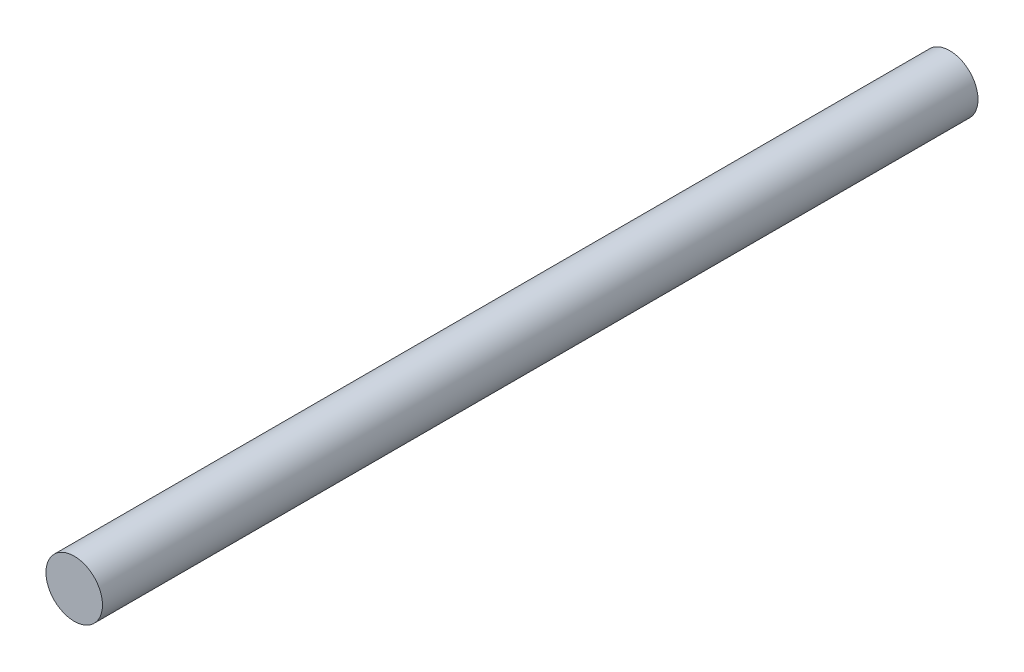
ISO-10303-21;
HEADER;
FILE_DESCRIPTION(('STEP AP214'),'2;1');
FILE_NAME('part.step','',(''),(''),'','','');
FILE_SCHEMA(('AUTOMOTIVE_DESIGN { 1 0 10303 214 1 1 1 1 }'));
ENDSEC;
DATA;
#1=APPLICATION_CONTEXT('core data for automotive mechanical design processes');
#2=APPLICATION_PROTOCOL_DEFINITION('international standard','automotive_design',2000,#1);
#3=PRODUCT_CONTEXT('',#1,'mechanical');
#4=PRODUCT('Part','Part','',(#3));
#5=PRODUCT_RELATED_PRODUCT_CATEGORY('part','',(#4));
#6=PRODUCT_DEFINITION_FORMATION('','',#4);
#7=PRODUCT_DEFINITION_CONTEXT('part definition',#1,'design');
#8=PRODUCT_DEFINITION('design','',#6,#7);
#9=PRODUCT_DEFINITION_SHAPE('','',#8);
#10=(LENGTH_UNIT() NAMED_UNIT(*) SI_UNIT(.MILLI.,.METRE.));
#11=(NAMED_UNIT(*) PLANE_ANGLE_UNIT() SI_UNIT($,.RADIAN.));
#12=(NAMED_UNIT(*) SI_UNIT($,.STERADIAN.) SOLID_ANGLE_UNIT());
#13=UNCERTAINTY_MEASURE_WITH_UNIT(LENGTH_MEASURE(1.E-05),#10,'distance_accuracy_value','');
#14=(GEOMETRIC_REPRESENTATION_CONTEXT(3) GLOBAL_UNCERTAINTY_ASSIGNED_CONTEXT((#13)) GLOBAL_UNIT_ASSIGNED_CONTEXT((#10,
#11,#12)) REPRESENTATION_CONTEXT('',''));
#15=CARTESIAN_POINT('',(0.,0.,0.));
#16=DIRECTION('',(0.,0.,1.));
#17=DIRECTION('',(1.,0.,0.));
#18=AXIS2_PLACEMENT_3D('',#15,#16,#17);
#19=CARTESIAN_POINT('',(0.,0.,15.8));
#20=DIRECTION('',(0.,0.,-1.));
#21=DIRECTION('',(-1.,0.,0.));
#22=AXIS2_PLACEMENT_3D('',#19,#20,#21);
#23=CYLINDRICAL_SURFACE('',#22,0.51);
#24=CARTESIAN_POINT('',(0.,0.,15.8));
#25=DIRECTION('',(0.,0.,1.));
#26=DIRECTION('',(1.,0.,0.));
#27=AXIS2_PLACEMENT_3D('',#24,#25,#26);
#28=CIRCLE('',#27,0.51);
#29=CARTESIAN_POINT('',(0.51,0.,15.8));
#30=VERTEX_POINT('',#29);
#31=EDGE_CURVE('E10',#30,#30,#28,.T.);
#32=ORIENTED_EDGE('',*,*,#31,.F.);
#33=EDGE_LOOP('',(#32));
#34=FACE_BOUND('',#33,.T.);
#35=CARTESIAN_POINT('',(0.,0.,0.));
#36=DIRECTION('',(0.,0.,1.));
#37=DIRECTION('',(1.,0.,0.));
#38=AXIS2_PLACEMENT_3D('',#35,#36,#37);
#39=CIRCLE('',#38,0.51);
#40=CARTESIAN_POINT('',(0.51,0.,0.));
#41=VERTEX_POINT('',#40);
#42=EDGE_CURVE('E36',#41,#41,#39,.T.);
#43=ORIENTED_EDGE('',*,*,#42,.T.);
#44=EDGE_LOOP('',(#43));
#45=FACE_BOUND('',#44,.T.);
#46=ADVANCED_FACE('F33',(#34,#45),#23,.T.);
#47=CARTESIAN_POINT('',(0.,0.,15.8));
#48=DIRECTION('',(0.,0.,1.));
#49=DIRECTION('',(1.,0.,0.));
#50=AXIS2_PLACEMENT_3D('',#47,#48,#49);
#51=PLANE('',#50);
#52=ORIENTED_EDGE('',*,*,#31,.T.);
#53=EDGE_LOOP('',(#52));
#54=FACE_BOUND('',#53,.T.);
#55=ADVANCED_FACE('F48',(#54),#51,.T.);
#56=CARTESIAN_POINT('',(0.,0.,0.));
#57=DIRECTION('',(0.,0.,1.));
#58=DIRECTION('',(1.,0.,0.));
#59=AXIS2_PLACEMENT_3D('',#56,#57,#58);
#60=PLANE('',#59);
#61=ORIENTED_EDGE('',*,*,#42,.F.);
#62=EDGE_LOOP('',(#61));
#63=FACE_BOUND('',#62,.T.);
#64=ADVANCED_FACE('F46',(#63),#60,.F.);
#65=CLOSED_SHELL('',(#46,#55,#64));
#66=MANIFOLD_SOLID_BREP('B2',#65);
#67=ADVANCED_BREP_SHAPE_REPRESENTATION('',(#18,#66),#14);
#68=SHAPE_DEFINITION_REPRESENTATION(#9,#67);
ENDSEC;
END-ISO-10303-21;
